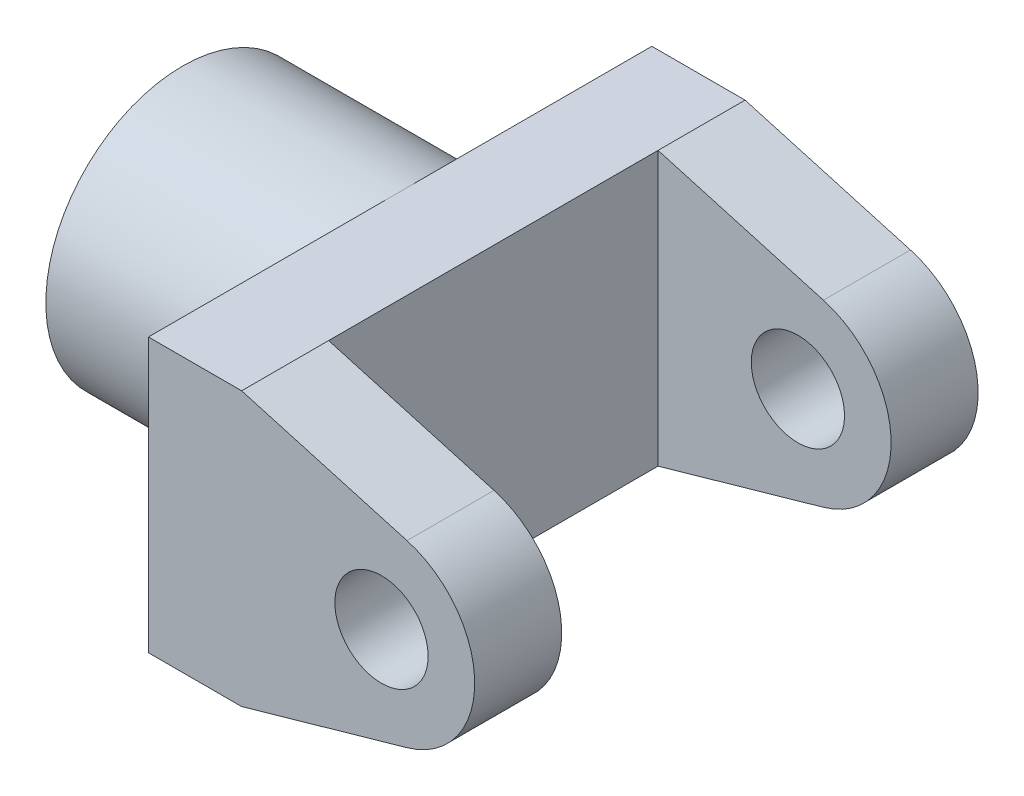
ISO-10303-21;
HEADER;
FILE_DESCRIPTION(('STEP AP214'),'2;1');
FILE_NAME('part.step','',(''),(''),'','','');
FILE_SCHEMA(('AUTOMOTIVE_DESIGN { 1 0 10303 214 1 1 1 1 }'));
ENDSEC;
DATA;
#1=APPLICATION_CONTEXT('core data for automotive mechanical design processes');
#2=APPLICATION_PROTOCOL_DEFINITION('international standard','automotive_design',2000,#1);
#3=PRODUCT_CONTEXT('',#1,'mechanical');
#4=PRODUCT('Part','Part','',(#3));
#5=PRODUCT_RELATED_PRODUCT_CATEGORY('part','',(#4));
#6=PRODUCT_DEFINITION_FORMATION('','',#4);
#7=PRODUCT_DEFINITION_CONTEXT('part definition',#1,'design');
#8=PRODUCT_DEFINITION('design','',#6,#7);
#9=PRODUCT_DEFINITION_SHAPE('','',#8);
#10=(LENGTH_UNIT() NAMED_UNIT(*) SI_UNIT(.MILLI.,.METRE.));
#11=(NAMED_UNIT(*) PLANE_ANGLE_UNIT() SI_UNIT($,.RADIAN.));
#12=(NAMED_UNIT(*) SI_UNIT($,.STERADIAN.) SOLID_ANGLE_UNIT());
#13=UNCERTAINTY_MEASURE_WITH_UNIT(LENGTH_MEASURE(1.E-05),#10,'distance_accuracy_value','');
#14=(GEOMETRIC_REPRESENTATION_CONTEXT(3) GLOBAL_UNCERTAINTY_ASSIGNED_CONTEXT((#13)) GLOBAL_UNIT_ASSIGNED_CONTEXT((#10,
#11,#12)) REPRESENTATION_CONTEXT('',''));
#15=CARTESIAN_POINT('',(0.,0.,0.));
#16=DIRECTION('',(0.,0.,1.));
#17=DIRECTION('',(1.,0.,0.));
#18=AXIS2_PLACEMENT_3D('',#15,#16,#17);
#19=CARTESIAN_POINT('',(-67.7836861019827,0.,107.787503811798));
#20=DIRECTION('',(-1.,0.,0.));
#21=DIRECTION('',(0.,-1.,0.));
#22=AXIS2_PLACEMENT_3D('',#19,#20,#21);
#23=PLANE('',#22);
#24=CARTESIAN_POINT('',(-67.7836861019827,0.,81.0575038117978));
#25=DIRECTION('',(-1.,0.,0.));
#26=DIRECTION('',(0.,-1.,0.));
#27=AXIS2_PLACEMENT_3D('',#24,#25,#26);
#28=CIRCLE('',#27,14.52);
#29=CARTESIAN_POINT('',(-67.7836861019827,-14.52,81.0575038117978));
#30=VERTEX_POINT('',#29);
#31=CARTESIAN_POINT('',(-67.7836861019827,14.52,81.0575038117978));
#32=VERTEX_POINT('',#31);
#33=EDGE_CURVE('E52',#30,#32,#28,.T.);
#34=ORIENTED_EDGE('',*,*,#33,.F.);
#35=DIRECTION('',(0.,0.,-1.));
#36=VECTOR('',#35,1.);
#37=CARTESIAN_POINT('',(-67.7836861019827,-14.52,107.787503811798));
#38=LINE('',#37,#36);
#39=CARTESIAN_POINT('',(-67.7836861019827,-14.52,107.787503811798));
#40=VERTEX_POINT('',#39);
#41=EDGE_CURVE('E306',#40,#30,#38,.T.);
#42=ORIENTED_EDGE('',*,*,#41,.F.);
#43=DIRECTION('',(0.,1.,0.));
#44=VECTOR('',#43,1.);
#45=CARTESIAN_POINT('',(-67.7836861019827,0.,107.787503811798));
#46=LINE('',#45,#44);
#47=CARTESIAN_POINT('',(-67.7836861019827,14.52,107.787503811798));
#48=VERTEX_POINT('',#47);
#49=EDGE_CURVE('E263',#40,#48,#46,.T.);
#50=ORIENTED_EDGE('',*,*,#49,.T.);
#51=DIRECTION('',(0.,0.,-1.));
#52=VECTOR('',#51,1.);
#53=CARTESIAN_POINT('',(-67.7836861019827,14.52,107.787503811798));
#54=LINE('',#53,#52);
#55=EDGE_CURVE('E310',#48,#32,#54,.T.);
#56=ORIENTED_EDGE('',*,*,#55,.T.);
#57=EDGE_LOOP('',(#34,#42,#50,#56));
#58=FACE_BOUND('',#57,.T.);
#59=ADVANCED_FACE('F40',(#58),#23,.T.);
#60=CARTESIAN_POINT('',(-40.3234769730333,-9.52180479097105,107.787503811798));
#61=DIRECTION('',(-0.273758497873683,0.961798463734448,0.));
#62=DIRECTION('',(-0.961798463734448,-0.273758497873683,0.));
#63=AXIS2_PLACEMENT_3D('',#60,#61,#62);
#64=PLANE('',#63);
#65=DIRECTION('',(0.,0.,-1.));
#66=VECTOR('',#65,1.);
#67=CARTESIAN_POINT('',(-57.8836861019827,-14.52,107.787503811798));
#68=LINE('',#67,#66);
#69=CARTESIAN_POINT('',(-57.8836861019827,-14.52,107.787503811798));
#70=VERTEX_POINT('',#69);
#71=CARTESIAN_POINT('',(-57.8836861019827,-14.52,98.5475038117978));
#72=VERTEX_POINT('',#71);
#73=EDGE_CURVE('E301',#70,#72,#68,.T.);
#74=ORIENTED_EDGE('',*,*,#73,.T.);
#75=DIRECTION('',(0.961798463734448,0.273758497873683,0.));
#76=VECTOR('',#75,1.);
#77=CARTESIAN_POINT('',(-40.3234769730333,-9.52180479097105,98.5475038117978));
#78=LINE('',#77,#76);
#79=CARTESIAN_POINT('',(-40.3234769730333,-9.52180479097105,98.5475038117978));
#80=VERTEX_POINT('',#79);
#81=EDGE_CURVE('E242',#72,#80,#78,.T.);
#82=ORIENTED_EDGE('',*,*,#81,.T.);
#83=DIRECTION('',(0.,0.,-1.));
#84=VECTOR('',#83,1.);
#85=CARTESIAN_POINT('',(-40.3234769730333,-9.52180479097105,107.787503811798));
#86=LINE('',#85,#84);
#87=CARTESIAN_POINT('',(-40.3234769730333,-9.52180479097105,107.787503811798));
#88=VERTEX_POINT('',#87);
#89=EDGE_CURVE('E50',#88,#80,#86,.T.);
#90=ORIENTED_EDGE('',*,*,#89,.F.);
#91=DIRECTION('',(0.961798463734448,0.273758497873683,0.));
#92=VECTOR('',#91,1.);
#93=CARTESIAN_POINT('',(-40.3234769730333,-9.52180479097105,107.787503811798));
#94=LINE('',#93,#92);
#95=EDGE_CURVE('E247',#70,#88,#94,.T.);
#96=ORIENTED_EDGE('',*,*,#95,.F.);
#97=EDGE_LOOP('',(#74,#82,#90,#96));
#98=FACE_BOUND('',#97,.T.);
#99=ADVANCED_FACE('F358',(#98),#64,.F.);
#100=CARTESIAN_POINT('',(-43.0336861019827,0.,107.787503811798));
#101=DIRECTION('',(0.,0.,-1.));
#102=DIRECTION('',(-1.,0.,0.));
#103=AXIS2_PLACEMENT_3D('',#100,#101,#102);
#104=CYLINDRICAL_SURFACE('',#103,9.9);
#105=CARTESIAN_POINT('',(-43.0336861019827,0.,98.5475038117978));
#106=DIRECTION('',(0.,0.,1.));
#107=DIRECTION('',(1.,0.,0.));
#108=AXIS2_PLACEMENT_3D('',#105,#106,#107);
#109=CIRCLE('',#108,9.9);
#110=CARTESIAN_POINT('',(-40.3234769730333,9.52180479097103,98.5475038117978));
#111=VERTEX_POINT('',#110);
#112=EDGE_CURVE('E239',#80,#111,#109,.T.);
#113=ORIENTED_EDGE('',*,*,#112,.T.);
#114=DIRECTION('',(0.,0.,-1.));
#115=VECTOR('',#114,1.);
#116=CARTESIAN_POINT('',(-40.3234769730333,9.52180479097103,107.787503811798));
#117=LINE('',#116,#115);
#118=CARTESIAN_POINT('',(-40.3234769730333,9.52180479097103,107.787503811798));
#119=VERTEX_POINT('',#118);
#120=EDGE_CURVE('E320',#119,#111,#117,.T.);
#121=ORIENTED_EDGE('',*,*,#120,.F.);
#122=CARTESIAN_POINT('',(-43.0336861019827,0.,107.787503811798));
#123=DIRECTION('',(0.,0.,1.));
#124=DIRECTION('',(1.,0.,0.));
#125=AXIS2_PLACEMENT_3D('',#122,#123,#124);
#126=CIRCLE('',#125,9.9);
#127=EDGE_CURVE('E251',#88,#119,#126,.T.);
#128=ORIENTED_EDGE('',*,*,#127,.F.);
#129=ORIENTED_EDGE('',*,*,#89,.T.);
#130=EDGE_LOOP('',(#113,#121,#128,#129));
#131=FACE_BOUND('',#130,.T.);
#132=ADVANCED_FACE('F366',(#131),#104,.T.);
#133=CARTESIAN_POINT('',(-40.3234769730333,9.52180479097103,107.787503811798));
#134=DIRECTION('',(0.273758497873682,0.961798463734448,0.));
#135=DIRECTION('',(-0.961798463734448,0.273758497873682,0.));
#136=AXIS2_PLACEMENT_3D('',#133,#134,#135);
#137=PLANE('',#136);
#138=DIRECTION('',(0.961798463734448,-0.273758497873682,0.));
#139=VECTOR('',#138,1.);
#140=CARTESIAN_POINT('',(-40.3234769730333,9.52180479097103,98.5475038117978));
#141=LINE('',#140,#139);
#142=CARTESIAN_POINT('',(-57.8836861019827,14.52,98.5475038117978));
#143=VERTEX_POINT('',#142);
#144=EDGE_CURVE('E235',#143,#111,#141,.T.);
#145=ORIENTED_EDGE('',*,*,#144,.F.);
#146=DIRECTION('',(0.,0.,-1.));
#147=VECTOR('',#146,1.);
#148=CARTESIAN_POINT('',(-57.8836861019827,14.52,107.787503811798));
#149=LINE('',#148,#147);
#150=CARTESIAN_POINT('',(-57.8836861019827,14.52,107.787503811798));
#151=VERTEX_POINT('',#150);
#152=EDGE_CURVE('E315',#151,#143,#149,.T.);
#153=ORIENTED_EDGE('',*,*,#152,.F.);
#154=DIRECTION('',(0.961798463734448,-0.273758497873682,0.));
#155=VECTOR('',#154,1.);
#156=CARTESIAN_POINT('',(-40.3234769730333,9.52180479097103,107.787503811798));
#157=LINE('',#156,#155);
#158=EDGE_CURVE('E255',#151,#119,#157,.T.);
#159=ORIENTED_EDGE('',*,*,#158,.T.);
#160=ORIENTED_EDGE('',*,*,#120,.T.);
#161=EDGE_LOOP('',(#145,#153,#159,#160));
#162=FACE_BOUND('',#161,.T.);
#163=ADVANCED_FACE('F389',(#162),#137,.T.);
#164=CARTESIAN_POINT('',(-43.0336861019827,0.,107.787503811798));
#165=DIRECTION('',(0.,0.,-1.));
#166=DIRECTION('',(-1.,0.,0.));
#167=AXIS2_PLACEMENT_3D('',#164,#165,#166);
#168=CYLINDRICAL_SURFACE('',#167,4.95);
#169=CARTESIAN_POINT('',(-43.0336861019827,0.,98.5475038117978));
#170=DIRECTION('',(0.,0.,1.));
#171=DIRECTION('',(1.,0.,0.));
#172=AXIS2_PLACEMENT_3D('',#169,#170,#171);
#173=CIRCLE('',#172,4.95);
#174=CARTESIAN_POINT('',(-38.0836861019827,0.,98.5475038117978));
#175=VERTEX_POINT('',#174);
#176=EDGE_CURVE('E44',#175,#175,#173,.T.);
#177=ORIENTED_EDGE('',*,*,#176,.F.);
#178=EDGE_LOOP('',(#177));
#179=FACE_BOUND('',#178,.T.);
#180=CARTESIAN_POINT('',(-43.0336861019827,0.,107.787503811798));
#181=DIRECTION('',(0.,0.,1.));
#182=DIRECTION('',(1.,0.,0.));
#183=AXIS2_PLACEMENT_3D('',#180,#181,#182);
#184=CIRCLE('',#183,4.95);
#185=CARTESIAN_POINT('',(-38.0836861019827,0.,107.787503811798));
#186=VERTEX_POINT('',#185);
#187=EDGE_CURVE('E270',#186,#186,#184,.T.);
#188=ORIENTED_EDGE('',*,*,#187,.T.);
#189=EDGE_LOOP('',(#188));
#190=FACE_BOUND('',#189,.T.);
#191=ADVANCED_FACE('F340',(#179,#190),#168,.F.);
#192=CARTESIAN_POINT('',(-40.3234769730333,-9.52180479097105,63.5675038117978));
#193=VERTEX_POINT('',#192);
#194=CARTESIAN_POINT('',(-40.3234769730333,-9.52180479097105,54.3275038117978));
#195=VERTEX_POINT('',#194);
#196=EDGE_CURVE('E324',#193,#195,#86,.T.);
#197=ORIENTED_EDGE('',*,*,#196,.F.);
#198=DIRECTION('',(-0.961798463734448,-0.273758497873683,0.));
#199=VECTOR('',#198,1.);
#200=CARTESIAN_POINT('',(-40.3234769730333,-9.52180479097105,63.5675038117978));
#201=LINE('',#200,#199);
#202=CARTESIAN_POINT('',(-57.8836861019827,-14.52,63.5675038117978));
#203=VERTEX_POINT('',#202);
#204=EDGE_CURVE('E231',#193,#203,#201,.T.);
#205=ORIENTED_EDGE('',*,*,#204,.T.);
#206=CARTESIAN_POINT('',(-57.8836861019827,-14.52,54.3275038117978));
#207=VERTEX_POINT('',#206);
#208=EDGE_CURVE('E274',#203,#207,#68,.T.);
#209=ORIENTED_EDGE('',*,*,#208,.T.);
#210=DIRECTION('',(0.961798463734448,0.273758497873683,0.));
#211=VECTOR('',#210,1.);
#212=CARTESIAN_POINT('',(-40.3234769730333,-9.52180479097105,54.3275038117978));
#213=LINE('',#212,#211);
#214=EDGE_CURVE('E246',#207,#195,#213,.T.);
#215=ORIENTED_EDGE('',*,*,#214,.T.);
#216=EDGE_LOOP('',(#197,#205,#209,#215));
#217=FACE_BOUND('',#216,.T.);
#218=ADVANCED_FACE('F42',(#217),#64,.F.);
#219=CARTESIAN_POINT('',(-40.3234769730333,9.52180479097103,63.5675038117978));
#220=VERTEX_POINT('',#219);
#221=CARTESIAN_POINT('',(-40.3234769730333,9.52180479097103,54.3275038117978));
#222=VERTEX_POINT('',#221);
#223=EDGE_CURVE('E319',#220,#222,#117,.T.);
#224=ORIENTED_EDGE('',*,*,#223,.F.);
#225=CARTESIAN_POINT('',(-43.0336861019827,0.,63.5675038117978));
#226=DIRECTION('',(0.,0.,-1.));
#227=DIRECTION('',(-1.,0.,0.));
#228=AXIS2_PLACEMENT_3D('',#225,#226,#227);
#229=CIRCLE('',#228,9.9);
#230=EDGE_CURVE('E227',#220,#193,#229,.T.);
#231=ORIENTED_EDGE('',*,*,#230,.T.);
#232=ORIENTED_EDGE('',*,*,#196,.T.);
#233=CARTESIAN_POINT('',(-43.0336861019827,0.,54.3275038117978));
#234=DIRECTION('',(0.,0.,1.));
#235=DIRECTION('',(1.,0.,0.));
#236=AXIS2_PLACEMENT_3D('',#233,#234,#235);
#237=CIRCLE('',#236,9.9);
#238=EDGE_CURVE('E278',#195,#222,#237,.T.);
#239=ORIENTED_EDGE('',*,*,#238,.T.);
#240=EDGE_LOOP('',(#224,#231,#232,#239));
#241=FACE_BOUND('',#240,.T.);
#242=ADVANCED_FACE('F386',(#241),#104,.T.);
#243=DIRECTION('',(-0.961798463734448,0.273758497873682,0.));
#244=VECTOR('',#243,1.);
#245=CARTESIAN_POINT('',(-40.3234769730333,9.52180479097103,63.5675038117978));
#246=LINE('',#245,#244);
#247=CARTESIAN_POINT('',(-57.8836861019827,14.52,63.5675038117978));
#248=VERTEX_POINT('',#247);
#249=EDGE_CURVE('E224',#220,#248,#246,.T.);
#250=ORIENTED_EDGE('',*,*,#249,.F.);
#251=ORIENTED_EDGE('',*,*,#223,.T.);
#252=DIRECTION('',(0.961798463734448,-0.273758497873682,0.));
#253=VECTOR('',#252,1.);
#254=CARTESIAN_POINT('',(-40.3234769730333,9.52180479097103,54.3275038117978));
#255=LINE('',#254,#253);
#256=CARTESIAN_POINT('',(-57.8836861019827,14.52,54.3275038117978));
#257=VERTEX_POINT('',#256);
#258=EDGE_CURVE('E282',#257,#222,#255,.T.);
#259=ORIENTED_EDGE('',*,*,#258,.F.);
#260=EDGE_CURVE('E314',#248,#257,#149,.T.);
#261=ORIENTED_EDGE('',*,*,#260,.F.);
#262=EDGE_LOOP('',(#250,#251,#259,#261));
#263=FACE_BOUND('',#262,.T.);
#264=ADVANCED_FACE('F381',(#263),#137,.T.);
#265=CARTESIAN_POINT('',(-43.0336861019827,14.52,107.787503811798));
#266=DIRECTION('',(0.,1.,0.));
#267=DIRECTION('',(-1.,0.,0.));
#268=AXIS2_PLACEMENT_3D('',#265,#266,#267);
#269=PLANE('',#268);
#270=DIRECTION('',(1.,0.,0.));
#271=VECTOR('',#270,1.);
#272=CARTESIAN_POINT('',(-43.0336861019827,14.52,54.3275038117978));
#273=LINE('',#272,#271);
#274=CARTESIAN_POINT('',(-67.7836861019827,14.52,54.3275038117978));
#275=VERTEX_POINT('',#274);
#276=EDGE_CURVE('E286',#275,#257,#273,.T.);
#277=ORIENTED_EDGE('',*,*,#276,.F.);
#278=EDGE_CURVE('E309',#32,#275,#54,.T.);
#279=ORIENTED_EDGE('',*,*,#278,.F.);
#280=ORIENTED_EDGE('',*,*,#55,.F.);
#281=DIRECTION('',(1.,0.,0.));
#282=VECTOR('',#281,1.);
#283=CARTESIAN_POINT('',(-43.0336861019827,14.52,107.787503811798));
#284=LINE('',#283,#282);
#285=EDGE_CURVE('E259',#48,#151,#284,.T.);
#286=ORIENTED_EDGE('',*,*,#285,.T.);
#287=ORIENTED_EDGE('',*,*,#152,.T.);
#288=DIRECTION('',(0.,0.,-1.));
#289=VECTOR('',#288,1.);
#290=CARTESIAN_POINT('',(-57.8836861019827,14.52,98.5475038117978));
#291=LINE('',#290,#289);
#292=EDGE_CURVE('E210',#143,#248,#291,.T.);
#293=ORIENTED_EDGE('',*,*,#292,.T.);
#294=ORIENTED_EDGE('',*,*,#260,.T.);
#295=EDGE_LOOP('',(#277,#279,#280,#286,#287,#293,#294));
#296=FACE_BOUND('',#295,.T.);
#297=ADVANCED_FACE('F375',(#296),#269,.T.);
#298=EDGE_CURVE('E11',#32,#30,#28,.T.);
#299=ORIENTED_EDGE('',*,*,#298,.F.);
#300=ORIENTED_EDGE('',*,*,#278,.T.);
#301=DIRECTION('',(0.,1.,0.));
#302=VECTOR('',#301,1.);
#303=CARTESIAN_POINT('',(-67.7836861019827,0.,54.3275038117978));
#304=LINE('',#303,#302);
#305=CARTESIAN_POINT('',(-67.7836861019827,-14.52,54.3275038117978));
#306=VERTEX_POINT('',#305);
#307=EDGE_CURVE('E290',#306,#275,#304,.T.);
#308=ORIENTED_EDGE('',*,*,#307,.F.);
#309=EDGE_CURVE('E305',#30,#306,#38,.T.);
#310=ORIENTED_EDGE('',*,*,#309,.F.);
#311=EDGE_LOOP('',(#299,#300,#308,#310));
#312=FACE_BOUND('',#311,.T.);
#313=ADVANCED_FACE('F362',(#312),#23,.T.);
#314=CARTESIAN_POINT('',(-43.0336861019827,-14.52,107.787503811798));
#315=DIRECTION('',(0.,1.,0.));
#316=DIRECTION('',(-1.,0.,0.));
#317=AXIS2_PLACEMENT_3D('',#314,#315,#316);
#318=PLANE('',#317);
#319=DIRECTION('',(1.,0.,0.));
#320=VECTOR('',#319,1.);
#321=CARTESIAN_POINT('',(-43.0336861019827,-14.52,54.3275038117978));
#322=LINE('',#321,#320);
#323=EDGE_CURVE('E294',#306,#207,#322,.T.);
#324=ORIENTED_EDGE('',*,*,#323,.T.);
#325=ORIENTED_EDGE('',*,*,#208,.F.);
#326=DIRECTION('',(0.,0.,-1.));
#327=VECTOR('',#326,1.);
#328=CARTESIAN_POINT('',(-57.8836861019827,-14.52,98.5475038117978));
#329=LINE('',#328,#327);
#330=EDGE_CURVE('E206',#72,#203,#329,.T.);
#331=ORIENTED_EDGE('',*,*,#330,.F.);
#332=ORIENTED_EDGE('',*,*,#73,.F.);
#333=DIRECTION('',(1.,0.,0.));
#334=VECTOR('',#333,1.);
#335=CARTESIAN_POINT('',(-43.0336861019827,-14.52,107.787503811798));
#336=LINE('',#335,#334);
#337=EDGE_CURVE('E267',#40,#70,#336,.T.);
#338=ORIENTED_EDGE('',*,*,#337,.F.);
#339=ORIENTED_EDGE('',*,*,#41,.T.);
#340=ORIENTED_EDGE('',*,*,#309,.T.);
#341=EDGE_LOOP('',(#324,#325,#331,#332,#338,#339,#340));
#342=FACE_BOUND('',#341,.T.);
#343=ADVANCED_FACE('F338',(#342),#318,.F.);
#344=CARTESIAN_POINT('',(-43.0336861019827,0.,63.5675038117978));
#345=DIRECTION('',(0.,0.,-1.));
#346=DIRECTION('',(-1.,0.,0.));
#347=AXIS2_PLACEMENT_3D('',#344,#345,#346);
#348=CIRCLE('',#347,4.95);
#349=CARTESIAN_POINT('',(-47.9836861019827,0.,63.5675038117978));
#350=VERTEX_POINT('',#349);
#351=EDGE_CURVE('E221',#350,#350,#348,.T.);
#352=ORIENTED_EDGE('',*,*,#351,.F.);
#353=EDGE_LOOP('',(#352));
#354=FACE_BOUND('',#353,.T.);
#355=CARTESIAN_POINT('',(-43.0336861019827,0.,54.3275038117978));
#356=DIRECTION('',(0.,0.,1.));
#357=DIRECTION('',(1.,0.,0.));
#358=AXIS2_PLACEMENT_3D('',#355,#356,#357);
#359=CIRCLE('',#358,4.95);
#360=CARTESIAN_POINT('',(-38.0836861019827,0.,54.3275038117978));
#361=VERTEX_POINT('',#360);
#362=EDGE_CURVE('E252',#361,#361,#359,.T.);
#363=ORIENTED_EDGE('',*,*,#362,.F.);
#364=EDGE_LOOP('',(#363));
#365=FACE_BOUND('',#364,.T.);
#366=ADVANCED_FACE('F334',(#354,#365),#168,.F.);
#367=CARTESIAN_POINT('',(-43.0336861019827,0.,107.787503811798));
#368=DIRECTION('',(0.,0.,1.));
#369=DIRECTION('',(1.,0.,0.));
#370=AXIS2_PLACEMENT_3D('',#367,#368,#369);
#371=PLANE('',#370);
#372=ORIENTED_EDGE('',*,*,#95,.T.);
#373=ORIENTED_EDGE('',*,*,#127,.T.);
#374=ORIENTED_EDGE('',*,*,#158,.F.);
#375=ORIENTED_EDGE('',*,*,#285,.F.);
#376=ORIENTED_EDGE('',*,*,#49,.F.);
#377=ORIENTED_EDGE('',*,*,#337,.T.);
#378=EDGE_LOOP('',(#372,#373,#374,#375,#376,#377));
#379=FACE_BOUND('',#378,.T.);
#380=ORIENTED_EDGE('',*,*,#187,.F.);
#381=EDGE_LOOP('',(#380));
#382=FACE_BOUND('',#381,.T.);
#383=ADVANCED_FACE('F337',(#379,#382),#371,.T.);
#384=CARTESIAN_POINT('',(-43.0336861019827,0.,54.3275038117978));
#385=DIRECTION('',(0.,0.,1.));
#386=DIRECTION('',(1.,0.,0.));
#387=AXIS2_PLACEMENT_3D('',#384,#385,#386);
#388=PLANE('',#387);
#389=ORIENTED_EDGE('',*,*,#214,.F.);
#390=ORIENTED_EDGE('',*,*,#323,.F.);
#391=ORIENTED_EDGE('',*,*,#307,.T.);
#392=ORIENTED_EDGE('',*,*,#276,.T.);
#393=ORIENTED_EDGE('',*,*,#258,.T.);
#394=ORIENTED_EDGE('',*,*,#238,.F.);
#395=EDGE_LOOP('',(#389,#390,#391,#392,#393,#394));
#396=FACE_BOUND('',#395,.T.);
#397=ORIENTED_EDGE('',*,*,#362,.T.);
#398=EDGE_LOOP('',(#397));
#399=FACE_BOUND('',#398,.T.);
#400=ADVANCED_FACE('F343',(#396,#399),#388,.F.);
#401=CARTESIAN_POINT('',(-57.8836861019827,14.52,98.5475038117978));
#402=DIRECTION('',(0.,0.,1.));
#403=DIRECTION('',(1.,0.,0.));
#404=AXIS2_PLACEMENT_3D('',#401,#402,#403);
#405=PLANE('',#404);
#406=ORIENTED_EDGE('',*,*,#176,.T.);
#407=EDGE_LOOP('',(#406));
#408=FACE_BOUND('',#407,.T.);
#409=DIRECTION('',(0.,-1.,0.));
#410=VECTOR('',#409,1.);
#411=CARTESIAN_POINT('',(-57.8836861019827,14.52,98.5475038117978));
#412=LINE('',#411,#410);
#413=EDGE_CURVE('E218',#143,#72,#412,.T.);
#414=ORIENTED_EDGE('',*,*,#413,.F.);
#415=ORIENTED_EDGE('',*,*,#144,.T.);
#416=ORIENTED_EDGE('',*,*,#112,.F.);
#417=ORIENTED_EDGE('',*,*,#81,.F.);
#418=EDGE_LOOP('',(#414,#415,#416,#417));
#419=FACE_BOUND('',#418,.T.);
#420=ADVANCED_FACE('F345',(#408,#419),#405,.F.);
#421=CARTESIAN_POINT('',(-57.8836861019827,14.52,63.5675038117978));
#422=DIRECTION('',(0.,0.,-1.));
#423=DIRECTION('',(-1.,0.,0.));
#424=AXIS2_PLACEMENT_3D('',#421,#422,#423);
#425=PLANE('',#424);
#426=ORIENTED_EDGE('',*,*,#351,.T.);
#427=EDGE_LOOP('',(#426));
#428=FACE_BOUND('',#427,.T.);
#429=ORIENTED_EDGE('',*,*,#230,.F.);
#430=ORIENTED_EDGE('',*,*,#249,.T.);
#431=DIRECTION('',(0.,-1.,0.));
#432=VECTOR('',#431,1.);
#433=CARTESIAN_POINT('',(-57.8836861019827,14.52,63.5675038117978));
#434=LINE('',#433,#432);
#435=EDGE_CURVE('E214',#248,#203,#434,.T.);
#436=ORIENTED_EDGE('',*,*,#435,.T.);
#437=ORIENTED_EDGE('',*,*,#204,.F.);
#438=EDGE_LOOP('',(#429,#430,#436,#437));
#439=FACE_BOUND('',#438,.T.);
#440=ADVANCED_FACE('F331',(#428,#439),#425,.F.);
#441=CARTESIAN_POINT('',(-57.8836861019827,14.52,98.5475038117978));
#442=DIRECTION('',(-1.,0.,0.));
#443=DIRECTION('',(0.,-1.,0.));
#444=AXIS2_PLACEMENT_3D('',#441,#442,#443);
#445=PLANE('',#444);
#446=ORIENTED_EDGE('',*,*,#330,.T.);
#447=ORIENTED_EDGE('',*,*,#435,.F.);
#448=ORIENTED_EDGE('',*,*,#292,.F.);
#449=ORIENTED_EDGE('',*,*,#413,.T.);
#450=EDGE_LOOP('',(#446,#447,#448,#449));
#451=FACE_BOUND('',#450,.T.);
#452=ADVANCED_FACE('F426',(#451),#445,.F.);
#453=CARTESIAN_POINT('',(-90.8836861019827,0.,81.0575038117978));
#454=DIRECTION('',(-1.,0.,0.));
#455=DIRECTION('',(0.,-1.,0.));
#456=AXIS2_PLACEMENT_3D('',#453,#454,#455);
#457=PLANE('',#456);
#458=DIRECTION('',(0.,0.,-1.));
#459=VECTOR('',#458,1.);
#460=CARTESIAN_POINT('',(-90.8836861019827,1.31999999999998,54.3275038117978));
#461=LINE('',#460,#459);
#462=CARTESIAN_POINT('',(-90.8836861019827,1.31999999999998,72.9137884434908));
#463=VERTEX_POINT('',#462);
#464=CARTESIAN_POINT('',(-90.8836861019827,1.31999999999998,70.8502953312324));
#465=VERTEX_POINT('',#464);
#466=EDGE_CURVE('E172',#463,#465,#461,.T.);
#467=ORIENTED_EDGE('',*,*,#466,.F.);
#468=CARTESIAN_POINT('',(-90.8836861019827,0.,81.0575038117978));
#469=DIRECTION('',(-1.,0.,0.));
#470=DIRECTION('',(0.,-1.,0.));
#471=AXIS2_PLACEMENT_3D('',#468,#469,#470);
#472=CIRCLE('',#471,8.25);
#473=CARTESIAN_POINT('',(-90.8836861019827,-1.32000000000002,72.9137884434908));
#474=VERTEX_POINT('',#473);
#475=EDGE_CURVE('E196',#474,#463,#472,.T.);
#476=ORIENTED_EDGE('',*,*,#475,.F.);
#477=DIRECTION('',(0.,0.,-1.));
#478=VECTOR('',#477,1.);
#479=CARTESIAN_POINT('',(-90.8836861019827,-1.32000000000002,54.3275038117978));
#480=LINE('',#479,#478);
#481=CARTESIAN_POINT('',(-90.8836861019827,-1.32000000000002,70.8502953312324));
#482=VERTEX_POINT('',#481);
#483=EDGE_CURVE('E176',#474,#482,#480,.T.);
#484=ORIENTED_EDGE('',*,*,#483,.T.);
#485=DIRECTION('',(0.,1.,0.));
#486=VECTOR('',#485,1.);
#487=CARTESIAN_POINT('',(-90.8836861019827,0.,70.8502953312324));
#488=LINE('',#487,#486);
#489=EDGE_CURVE('E163',#482,#465,#488,.T.);
#490=ORIENTED_EDGE('',*,*,#489,.T.);
#491=EDGE_LOOP('',(#467,#476,#484,#490));
#492=FACE_BOUND('',#491,.T.);
#493=CARTESIAN_POINT('',(-90.8836861019827,0.,81.0575038117978));
#494=DIRECTION('',(-1.,0.,0.));
#495=DIRECTION('',(0.,-1.,0.));
#496=AXIS2_PLACEMENT_3D('',#493,#494,#495);
#497=CIRCLE('',#496,14.52);
#498=CARTESIAN_POINT('',(-90.8836861019827,-14.52,81.0575038117978));
#499=VERTEX_POINT('',#498);
#500=EDGE_CURVE('E203',#499,#499,#497,.T.);
#501=ORIENTED_EDGE('',*,*,#500,.T.);
#502=EDGE_LOOP('',(#501));
#503=FACE_BOUND('',#502,.T.);
#504=ADVANCED_FACE('F417',(#492,#503),#457,.T.);
#505=CARTESIAN_POINT('',(-90.8836861019827,0.,81.0575038117978));
#506=DIRECTION('',(1.,0.,0.));
#507=DIRECTION('',(0.,1.,0.));
#508=AXIS2_PLACEMENT_3D('',#505,#506,#507);
#509=CYLINDRICAL_SURFACE('',#508,14.52);
#510=ORIENTED_EDGE('',*,*,#500,.F.);
#511=EDGE_LOOP('',(#510));
#512=FACE_BOUND('',#511,.T.);
#513=ORIENTED_EDGE('',*,*,#33,.T.);
#514=ORIENTED_EDGE('',*,*,#298,.T.);
#515=EDGE_LOOP('',(#513,#514));
#516=FACE_BOUND('',#515,.T.);
#517=ADVANCED_FACE('F415',(#512,#516),#509,.T.);
#518=CARTESIAN_POINT('',(-90.8836861019827,0.,81.0575038117978));
#519=DIRECTION('',(1.,0.,0.));
#520=DIRECTION('',(0.,1.,0.));
#521=AXIS2_PLACEMENT_3D('',#518,#519,#520);
#522=CYLINDRICAL_SURFACE('',#521,8.25);
#523=DIRECTION('',(-1.,0.,0.));
#524=VECTOR('',#523,1.);
#525=CARTESIAN_POINT('',(-71.0836861019827,1.31999999999999,72.9137884434908));
#526=LINE('',#525,#524);
#527=CARTESIAN_POINT('',(-71.0836861019827,1.31999999999999,72.9137884434908));
#528=VERTEX_POINT('',#527);
#529=EDGE_CURVE('E191',#528,#463,#526,.T.);
#530=ORIENTED_EDGE('',*,*,#529,.F.);
#531=CARTESIAN_POINT('',(-71.0836861019827,0.,81.0575038117978));
#532=DIRECTION('',(-1.,0.,0.));
#533=DIRECTION('',(0.,-1.,0.));
#534=AXIS2_PLACEMENT_3D('',#531,#532,#533);
#535=CIRCLE('',#534,8.25);
#536=CARTESIAN_POINT('',(-71.0836861019827,-1.32000000000001,72.9137884434908));
#537=VERTEX_POINT('',#536);
#538=EDGE_CURVE('E156',#537,#528,#535,.F.);
#539=ORIENTED_EDGE('',*,*,#538,.F.);
#540=DIRECTION('',(-1.,0.,0.));
#541=VECTOR('',#540,1.);
#542=CARTESIAN_POINT('',(-71.0836861019827,-1.32000000000001,72.9137884434908));
#543=LINE('',#542,#541);
#544=EDGE_CURVE('E153',#537,#474,#543,.T.);
#545=ORIENTED_EDGE('',*,*,#544,.T.);
#546=ORIENTED_EDGE('',*,*,#475,.T.);
#547=EDGE_LOOP('',(#530,#539,#545,#546));
#548=FACE_BOUND('',#547,.T.);
#549=CARTESIAN_POINT('',(-67.7836861019827,0.,81.0575038117978));
#550=DIRECTION('',(-1.,0.,0.));
#551=DIRECTION('',(0.,-1.,0.));
#552=AXIS2_PLACEMENT_3D('',#549,#550,#551);
#553=CIRCLE('',#552,8.25);
#554=CARTESIAN_POINT('',(-67.7836861019827,-8.25000000000001,81.0575038117978));
#555=VERTEX_POINT('',#554);
#556=EDGE_CURVE('E190',#555,#555,#553,.T.);
#557=ORIENTED_EDGE('',*,*,#556,.F.);
#558=EDGE_LOOP('',(#557));
#559=FACE_BOUND('',#558,.T.);
#560=ADVANCED_FACE('F372',(#548,#559),#522,.F.);
#561=ORIENTED_EDGE('',*,*,#556,.T.);
#562=EDGE_LOOP('',(#561));
#563=FACE_BOUND('',#562,.T.);
#564=ADVANCED_FACE('F361',(#563),#23,.T.);
#565=CARTESIAN_POINT('',(-71.0836861019827,0.,70.8502953312324));
#566=DIRECTION('',(0.,0.,1.));
#567=DIRECTION('',(1.,0.,0.));
#568=AXIS2_PLACEMENT_3D('',#565,#566,#567);
#569=PLANE('',#568);
#570=ORIENTED_EDGE('',*,*,#489,.F.);
#571=DIRECTION('',(-1.,0.,0.));
#572=VECTOR('',#571,1.);
#573=CARTESIAN_POINT('',(-71.0836861019827,-1.32000000000001,70.8502953312324));
#574=LINE('',#573,#572);
#575=CARTESIAN_POINT('',(-71.0836861019827,-1.32000000000001,70.8502953312324));
#576=VERTEX_POINT('',#575);
#577=EDGE_CURVE('E150',#576,#482,#574,.T.);
#578=ORIENTED_EDGE('',*,*,#577,.F.);
#579=DIRECTION('',(0.,1.,0.));
#580=VECTOR('',#579,1.);
#581=CARTESIAN_POINT('',(-71.0836861019827,0.,70.8502953312324));
#582=LINE('',#581,#580);
#583=CARTESIAN_POINT('',(-71.0836861019827,1.31999999999999,70.8502953312324));
#584=VERTEX_POINT('',#583);
#585=EDGE_CURVE('E157',#576,#584,#582,.T.);
#586=ORIENTED_EDGE('',*,*,#585,.T.);
#587=DIRECTION('',(-1.,0.,0.));
#588=VECTOR('',#587,1.);
#589=CARTESIAN_POINT('',(-71.0836861019827,1.31999999999999,70.8502953312324));
#590=LINE('',#589,#588);
#591=EDGE_CURVE('E187',#584,#465,#590,.T.);
#592=ORIENTED_EDGE('',*,*,#591,.T.);
#593=EDGE_LOOP('',(#570,#578,#586,#592));
#594=FACE_BOUND('',#593,.T.);
#595=ADVANCED_FACE('F160',(#594),#569,.T.);
#596=CARTESIAN_POINT('',(-71.0836861019827,1.31999999999998,54.3275038117978));
#597=DIRECTION('',(0.,1.,0.));
#598=DIRECTION('',(-1.,0.,0.));
#599=AXIS2_PLACEMENT_3D('',#596,#597,#598);
#600=PLANE('',#599);
#601=ORIENTED_EDGE('',*,*,#466,.T.);
#602=ORIENTED_EDGE('',*,*,#591,.F.);
#603=DIRECTION('',(0.,0.,-1.));
#604=VECTOR('',#603,1.);
#605=CARTESIAN_POINT('',(-71.0836861019827,1.31999999999998,54.3275038117978));
#606=LINE('',#605,#604);
#607=EDGE_CURVE('E166',#528,#584,#606,.T.);
#608=ORIENTED_EDGE('',*,*,#607,.F.);
#609=ORIENTED_EDGE('',*,*,#529,.T.);
#610=EDGE_LOOP('',(#601,#602,#608,#609));
#611=FACE_BOUND('',#610,.T.);
#612=ADVANCED_FACE('F555',(#611),#600,.F.);
#613=CARTESIAN_POINT('',(-71.0836861019827,-1.32000000000002,54.3275038117978));
#614=DIRECTION('',(0.,1.,0.));
#615=DIRECTION('',(-1.,0.,0.));
#616=AXIS2_PLACEMENT_3D('',#613,#614,#615);
#617=PLANE('',#616);
#618=ORIENTED_EDGE('',*,*,#483,.F.);
#619=ORIENTED_EDGE('',*,*,#544,.F.);
#620=DIRECTION('',(0.,0.,-1.));
#621=VECTOR('',#620,1.);
#622=CARTESIAN_POINT('',(-71.0836861019827,-1.32000000000002,54.3275038117978));
#623=LINE('',#622,#621);
#624=EDGE_CURVE('E59',#537,#576,#623,.T.);
#625=ORIENTED_EDGE('',*,*,#624,.T.);
#626=ORIENTED_EDGE('',*,*,#577,.T.);
#627=EDGE_LOOP('',(#618,#619,#625,#626));
#628=FACE_BOUND('',#627,.T.);
#629=ADVANCED_FACE('F149',(#628),#617,.T.);
#630=CARTESIAN_POINT('',(-71.0836861019827,0.,54.3275038117978));
#631=DIRECTION('',(-1.,0.,0.));
#632=DIRECTION('',(0.,-1.,0.));
#633=AXIS2_PLACEMENT_3D('',#630,#631,#632);
#634=PLANE('',#633);
#635=ORIENTED_EDGE('',*,*,#585,.F.);
#636=ORIENTED_EDGE('',*,*,#624,.F.);
#637=ORIENTED_EDGE('',*,*,#538,.T.);
#638=ORIENTED_EDGE('',*,*,#607,.T.);
#639=EDGE_LOOP('',(#635,#636,#637,#638));
#640=FACE_BOUND('',#639,.T.);
#641=ADVANCED_FACE('F169',(#640),#634,.T.);
#642=CLOSED_SHELL('',(#59,#99,#132,#163,#191,#218,#242,#264,#297,#313,#343,#366,#383,#400,#420,
#440,#452,#504,#517,#560,#564,#595,#612,#629,#641));
#643=MANIFOLD_SOLID_BREP('B2',#642);
#644=ADVANCED_BREP_SHAPE_REPRESENTATION('',(#18,#643),#14);
#645=SHAPE_DEFINITION_REPRESENTATION(#9,#644);
ENDSEC;
END-ISO-10303-21;
